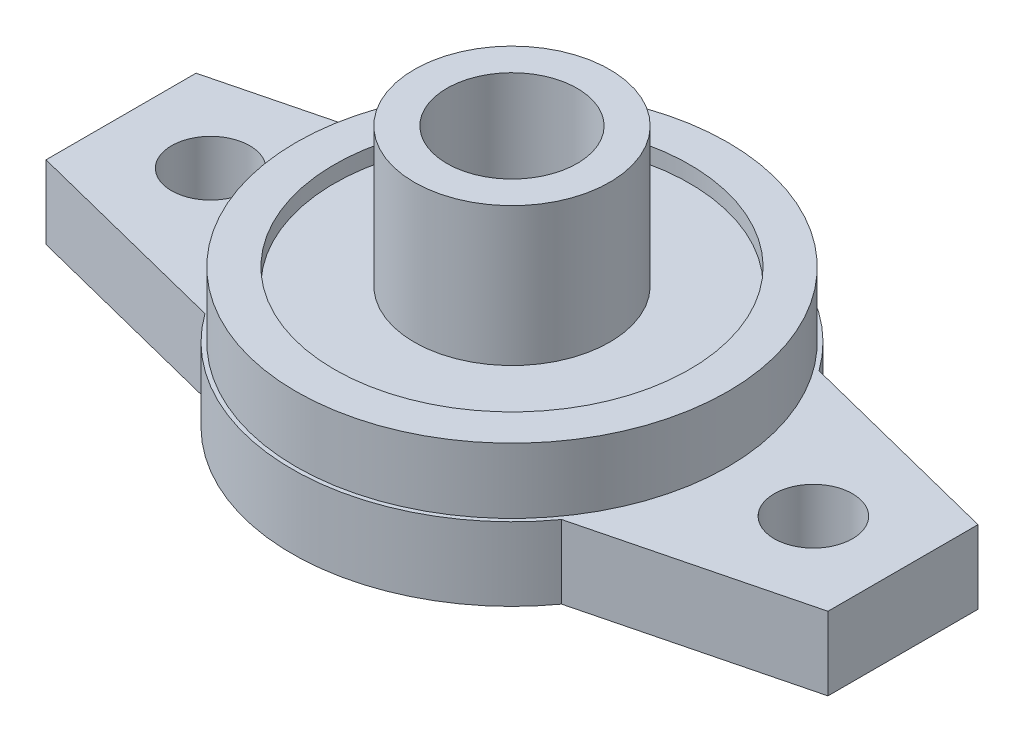
ISO-10303-21;
HEADER;
FILE_DESCRIPTION(('STEP AP214'),'2;1');
FILE_NAME('part.step','',(''),(''),'','','');
FILE_SCHEMA(('AUTOMOTIVE_DESIGN { 1 0 10303 214 1 1 1 1 }'));
ENDSEC;
DATA;
#1=APPLICATION_CONTEXT('core data for automotive mechanical design processes');
#2=APPLICATION_PROTOCOL_DEFINITION('international standard','automotive_design',2000,#1);
#3=PRODUCT_CONTEXT('',#1,'mechanical');
#4=PRODUCT('Part','Part','',(#3));
#5=PRODUCT_RELATED_PRODUCT_CATEGORY('part','',(#4));
#6=PRODUCT_DEFINITION_FORMATION('','',#4);
#7=PRODUCT_DEFINITION_CONTEXT('part definition',#1,'design');
#8=PRODUCT_DEFINITION('design','',#6,#7);
#9=PRODUCT_DEFINITION_SHAPE('','',#8);
#10=(LENGTH_UNIT() NAMED_UNIT(*) SI_UNIT(.MILLI.,.METRE.));
#11=(NAMED_UNIT(*) PLANE_ANGLE_UNIT() SI_UNIT($,.RADIAN.));
#12=(NAMED_UNIT(*) SI_UNIT($,.STERADIAN.) SOLID_ANGLE_UNIT());
#13=UNCERTAINTY_MEASURE_WITH_UNIT(LENGTH_MEASURE(1.E-05),#10,'distance_accuracy_value','');
#14=(GEOMETRIC_REPRESENTATION_CONTEXT(3) GLOBAL_UNCERTAINTY_ASSIGNED_CONTEXT((#13)) GLOBAL_UNIT_ASSIGNED_CONTEXT((#10,
#11,#12)) REPRESENTATION_CONTEXT('',''));
#15=CARTESIAN_POINT('',(0.,0.,0.));
#16=DIRECTION('',(0.,0.,1.));
#17=DIRECTION('',(1.,0.,0.));
#18=AXIS2_PLACEMENT_3D('',#15,#16,#17);
#19=CARTESIAN_POINT('',(0.,8.5,0.));
#20=DIRECTION('',(0.,1.,0.));
#21=DIRECTION('',(0.,0.,1.));
#22=AXIS2_PLACEMENT_3D('',#19,#20,#21);
#23=PLANE('',#22);
#24=CARTESIAN_POINT('',(0.,8.5,0.));
#25=DIRECTION('',(0.,1.,0.));
#26=DIRECTION('',(0.,0.,1.));
#27=AXIS2_PLACEMENT_3D('',#24,#25,#26);
#28=CIRCLE('',#27,10.9);
#29=CARTESIAN_POINT('',(0.,8.5,10.9));
#30=VERTEX_POINT('',#29);
#31=EDGE_CURVE('E209',#30,#30,#28,.T.);
#32=ORIENTED_EDGE('',*,*,#31,.F.);
#33=EDGE_LOOP('',(#32));
#34=FACE_BOUND('',#33,.T.);
#35=CARTESIAN_POINT('',(0.,8.5,0.));
#36=DIRECTION('',(0.,1.,0.));
#37=DIRECTION('',(0.,0.,1.));
#38=AXIS2_PLACEMENT_3D('',#35,#36,#37);
#39=CIRCLE('',#38,13.25);
#40=CARTESIAN_POINT('',(0.,8.5,13.25));
#41=VERTEX_POINT('',#40);
#42=EDGE_CURVE('E143',#41,#41,#39,.T.);
#43=ORIENTED_EDGE('',*,*,#42,.T.);
#44=EDGE_LOOP('',(#43));
#45=FACE_BOUND('',#44,.T.);
#46=ADVANCED_FACE('F37',(#34,#45),#23,.T.);
#47=CARTESIAN_POINT('',(0.,4.5,0.));
#48=DIRECTION('',(0.,1.,0.));
#49=DIRECTION('',(0.,0.,1.));
#50=AXIS2_PLACEMENT_3D('',#47,#48,#49);
#51=PLANE('',#50);
#52=CARTESIAN_POINT('',(18.5,4.5,0.));
#53=DIRECTION('',(0.,1.,0.));
#54=DIRECTION('',(0.,0.,1.));
#55=AXIS2_PLACEMENT_3D('',#52,#53,#54);
#56=CIRCLE('',#55,2.4);
#57=CARTESIAN_POINT('',(18.5,4.5,2.4));
#58=VERTEX_POINT('',#57);
#59=EDGE_CURVE('E131',#58,#58,#56,.F.);
#60=ORIENTED_EDGE('',*,*,#59,.T.);
#61=EDGE_LOOP('',(#60));
#62=FACE_BOUND('',#61,.T.);
#63=DIRECTION('',(0.96954322901117,0.,0.244920246363167));
#64=VECTOR('',#63,1.);
#65=CARTESIAN_POINT('',(-2.5331585410498,4.5,10.0277814837932));
#66=LINE('',#65,#64);
#67=CARTESIAN_POINT('',(-24.,4.5,4.60495561956913));
#68=VERTEX_POINT('',#67);
#69=CARTESIAN_POINT('',(-10.945124025003,4.5,7.90280077423838));
#70=VERTEX_POINT('',#69);
#71=EDGE_CURVE('E192',#68,#70,#66,.T.);
#72=ORIENTED_EDGE('',*,*,#71,.T.);
#73=CARTESIAN_POINT('',(0.,4.5,0.));
#74=DIRECTION('',(0.,1.,0.));
#75=DIRECTION('',(0.,0.,1.));
#76=AXIS2_PLACEMENT_3D('',#73,#74,#75);
#77=CIRCLE('',#76,13.5);
#78=CARTESIAN_POINT('',(10.945124025003,4.5,7.90280077423838));
#79=VERTEX_POINT('',#78);
#80=EDGE_CURVE('E93',#70,#79,#77,.T.);
#81=ORIENTED_EDGE('',*,*,#80,.T.);
#82=DIRECTION('',(-0.96954322901117,0.,0.244920246363167));
#83=VECTOR('',#82,1.);
#84=CARTESIAN_POINT('',(2.5331585410498,4.5,10.0277814837932));
#85=LINE('',#84,#83);
#86=CARTESIAN_POINT('',(24.,4.5,4.60495561956913));
#87=VERTEX_POINT('',#86);
#88=EDGE_CURVE('E178',#87,#79,#85,.T.);
#89=ORIENTED_EDGE('',*,*,#88,.F.);
#90=DIRECTION('',(0.,0.,1.));
#91=VECTOR('',#90,1.);
#92=CARTESIAN_POINT('',(24.,4.5,0.));
#93=LINE('',#92,#91);
#94=CARTESIAN_POINT('',(24.,4.5,-4.60495561956913));
#95=VERTEX_POINT('',#94);
#96=EDGE_CURVE('E190',#95,#87,#93,.T.);
#97=ORIENTED_EDGE('',*,*,#96,.F.);
#98=DIRECTION('',(-0.96954322901117,0.,-0.244920246363167));
#99=VECTOR('',#98,1.);
#100=CARTESIAN_POINT('',(2.5331585410498,4.5,-10.0277814837932));
#101=LINE('',#100,#99);
#102=CARTESIAN_POINT('',(10.945124025003,4.5,-7.90280077423838));
#103=VERTEX_POINT('',#102);
#104=EDGE_CURVE('E114',#95,#103,#101,.T.);
#105=ORIENTED_EDGE('',*,*,#104,.T.);
#106=CARTESIAN_POINT('',(-10.945124025003,4.5,-7.90280077423838));
#107=VERTEX_POINT('',#106);
#108=EDGE_CURVE('E106',#103,#107,#77,.T.);
#109=ORIENTED_EDGE('',*,*,#108,.T.);
#110=DIRECTION('',(0.96954322901117,0.,-0.244920246363167));
#111=VECTOR('',#110,1.);
#112=CARTESIAN_POINT('',(-2.5331585410498,4.5,-10.0277814837932));
#113=LINE('',#112,#111);
#114=CARTESIAN_POINT('',(-24.,4.5,-4.60495561956913));
#115=VERTEX_POINT('',#114);
#116=EDGE_CURVE('E111',#115,#107,#113,.T.);
#117=ORIENTED_EDGE('',*,*,#116,.F.);
#118=DIRECTION('',(0.,0.,1.));
#119=VECTOR('',#118,1.);
#120=CARTESIAN_POINT('',(-24.,4.5,0.));
#121=LINE('',#120,#119);
#122=EDGE_CURVE('E54',#115,#68,#121,.T.);
#123=ORIENTED_EDGE('',*,*,#122,.T.);
#124=EDGE_LOOP('',(#72,#81,#89,#97,#105,#109,#117,#123));
#125=FACE_BOUND('',#124,.T.);
#126=CARTESIAN_POINT('',(-18.5,4.5,0.));
#127=DIRECTION('',(0.,1.,0.));
#128=DIRECTION('',(0.,0.,1.));
#129=AXIS2_PLACEMENT_3D('',#126,#127,#128);
#130=CIRCLE('',#129,2.4);
#131=CARTESIAN_POINT('',(-18.5,4.5,2.4));
#132=VERTEX_POINT('',#131);
#133=EDGE_CURVE('E166',#132,#132,#130,.T.);
#134=ORIENTED_EDGE('',*,*,#133,.F.);
#135=EDGE_LOOP('',(#134));
#136=FACE_BOUND('',#135,.T.);
#137=CARTESIAN_POINT('',(0.,4.5,0.));
#138=DIRECTION('',(0.,1.,0.));
#139=DIRECTION('',(0.,0.,1.));
#140=AXIS2_PLACEMENT_3D('',#137,#138,#139);
#141=CIRCLE('',#140,13.25);
#142=CARTESIAN_POINT('',(0.,4.5,13.25));
#143=VERTEX_POINT('',#142);
#144=EDGE_CURVE('E197',#143,#143,#141,.T.);
#145=ORIENTED_EDGE('',*,*,#144,.F.);
#146=EDGE_LOOP('',(#145));
#147=FACE_BOUND('',#146,.T.);
#148=ADVANCED_FACE('F108',(#62,#125,#136,#147),#51,.T.);
#149=CARTESIAN_POINT('',(-2.5331585410498,4.5,10.0277814837932));
#150=DIRECTION('',(0.244920246363167,0.,-0.96954322901117));
#151=DIRECTION('',(-0.96954322901117,0.,-0.244920246363167));
#152=AXIS2_PLACEMENT_3D('',#149,#150,#151);
#153=PLANE('',#152);
#154=DIRECTION('',(0.96954322901117,0.,0.244920246363167));
#155=VECTOR('',#154,1.);
#156=CARTESIAN_POINT('',(-2.5331585410498,0.,10.0277814837932));
#157=LINE('',#156,#155);
#158=CARTESIAN_POINT('',(-24.,0.,4.60495561956913));
#159=VERTEX_POINT('',#158);
#160=CARTESIAN_POINT('',(-10.945124025003,0.,7.90280077423838));
#161=VERTEX_POINT('',#160);
#162=EDGE_CURVE('E142',#159,#161,#157,.T.);
#163=ORIENTED_EDGE('',*,*,#162,.T.);
#164=DIRECTION('',(0.,-1.,0.));
#165=VECTOR('',#164,1.);
#166=CARTESIAN_POINT('',(-10.945124025003,4.5,7.90280077423838));
#167=LINE('',#166,#165);
#168=EDGE_CURVE('E11',#70,#161,#167,.T.);
#169=ORIENTED_EDGE('',*,*,#168,.F.);
#170=ORIENTED_EDGE('',*,*,#71,.F.);
#171=DIRECTION('',(0.,-1.,0.));
#172=VECTOR('',#171,1.);
#173=CARTESIAN_POINT('',(-24.,4.5,4.60495561956913));
#174=LINE('',#173,#172);
#175=EDGE_CURVE('E138',#68,#159,#174,.T.);
#176=ORIENTED_EDGE('',*,*,#175,.T.);
#177=EDGE_LOOP('',(#163,#169,#170,#176));
#178=FACE_BOUND('',#177,.T.);
#179=ADVANCED_FACE('F245',(#178),#153,.F.);
#180=CARTESIAN_POINT('',(0.,4.5,0.));
#181=DIRECTION('',(0.,-1.,0.));
#182=DIRECTION('',(0.,0.,-1.));
#183=AXIS2_PLACEMENT_3D('',#180,#181,#182);
#184=CYLINDRICAL_SURFACE('',#183,13.5);
#185=CARTESIAN_POINT('',(0.,0.,0.));
#186=DIRECTION('',(0.,1.,0.));
#187=DIRECTION('',(0.,0.,1.));
#188=AXIS2_PLACEMENT_3D('',#185,#186,#187);
#189=CIRCLE('',#188,13.5);
#190=CARTESIAN_POINT('',(10.945124025003,0.,7.90280077423838));
#191=VERTEX_POINT('',#190);
#192=EDGE_CURVE('E146',#161,#191,#189,.T.);
#193=ORIENTED_EDGE('',*,*,#192,.T.);
#194=DIRECTION('',(0.,-1.,0.));
#195=VECTOR('',#194,1.);
#196=CARTESIAN_POINT('',(10.945124025003,4.5,7.90280077423838));
#197=LINE('',#196,#195);
#198=EDGE_CURVE('E46',#79,#191,#197,.T.);
#199=ORIENTED_EDGE('',*,*,#198,.F.);
#200=ORIENTED_EDGE('',*,*,#80,.F.);
#201=ORIENTED_EDGE('',*,*,#168,.T.);
#202=EDGE_LOOP('',(#193,#199,#200,#201));
#203=FACE_BOUND('',#202,.T.);
#204=ADVANCED_FACE('F179',(#203),#184,.T.);
#205=CARTESIAN_POINT('',(2.5331585410498,4.5,10.0277814837932));
#206=DIRECTION('',(0.244920246363167,0.,0.96954322901117));
#207=DIRECTION('',(0.96954322901117,0.,-0.244920246363167));
#208=AXIS2_PLACEMENT_3D('',#205,#206,#207);
#209=PLANE('',#208);
#210=DIRECTION('',(-0.96954322901117,0.,0.244920246363167));
#211=VECTOR('',#210,1.);
#212=CARTESIAN_POINT('',(2.5331585410498,0.,10.0277814837932));
#213=LINE('',#212,#211);
#214=CARTESIAN_POINT('',(24.,0.,4.60495561956913));
#215=VERTEX_POINT('',#214);
#216=EDGE_CURVE('E149',#215,#191,#213,.T.);
#217=ORIENTED_EDGE('',*,*,#216,.F.);
#218=DIRECTION('',(0.,-1.,0.));
#219=VECTOR('',#218,1.);
#220=CARTESIAN_POINT('',(24.,4.5,4.60495561956913));
#221=LINE('',#220,#219);
#222=EDGE_CURVE('E172',#87,#215,#221,.T.);
#223=ORIENTED_EDGE('',*,*,#222,.F.);
#224=ORIENTED_EDGE('',*,*,#88,.T.);
#225=ORIENTED_EDGE('',*,*,#198,.T.);
#226=EDGE_LOOP('',(#217,#223,#224,#225));
#227=FACE_BOUND('',#226,.T.);
#228=ADVANCED_FACE('F176',(#227),#209,.T.);
#229=CARTESIAN_POINT('',(24.,4.5,0.));
#230=DIRECTION('',(1.,0.,0.));
#231=DIRECTION('',(0.,0.,-1.));
#232=AXIS2_PLACEMENT_3D('',#229,#230,#231);
#233=PLANE('',#232);
#234=DIRECTION('',(0.,0.,1.));
#235=VECTOR('',#234,1.);
#236=CARTESIAN_POINT('',(24.,0.,0.));
#237=LINE('',#236,#235);
#238=CARTESIAN_POINT('',(24.,0.,-4.60495561956913));
#239=VERTEX_POINT('',#238);
#240=EDGE_CURVE('E152',#239,#215,#237,.T.);
#241=ORIENTED_EDGE('',*,*,#240,.F.);
#242=DIRECTION('',(0.,-1.,0.));
#243=VECTOR('',#242,1.);
#244=CARTESIAN_POINT('',(24.,4.5,-4.60495561956913));
#245=LINE('',#244,#243);
#246=EDGE_CURVE('E170',#95,#239,#245,.T.);
#247=ORIENTED_EDGE('',*,*,#246,.F.);
#248=ORIENTED_EDGE('',*,*,#96,.T.);
#249=ORIENTED_EDGE('',*,*,#222,.T.);
#250=EDGE_LOOP('',(#241,#247,#248,#249));
#251=FACE_BOUND('',#250,.T.);
#252=ADVANCED_FACE('F188',(#251),#233,.T.);
#253=CARTESIAN_POINT('',(2.5331585410498,4.5,-10.0277814837932));
#254=DIRECTION('',(-0.244920246363167,0.,0.96954322901117));
#255=DIRECTION('',(0.96954322901117,0.,0.244920246363167));
#256=AXIS2_PLACEMENT_3D('',#253,#254,#255);
#257=PLANE('',#256);
#258=DIRECTION('',(-0.96954322901117,0.,-0.244920246363167));
#259=VECTOR('',#258,1.);
#260=CARTESIAN_POINT('',(2.5331585410498,0.,-10.0277814837932));
#261=LINE('',#260,#259);
#262=CARTESIAN_POINT('',(10.945124025003,0.,-7.90280077423838));
#263=VERTEX_POINT('',#262);
#264=EDGE_CURVE('E155',#239,#263,#261,.T.);
#265=ORIENTED_EDGE('',*,*,#264,.T.);
#266=DIRECTION('',(0.,-1.,0.));
#267=VECTOR('',#266,1.);
#268=CARTESIAN_POINT('',(10.945124025003,4.5,-7.90280077423838));
#269=LINE('',#268,#267);
#270=EDGE_CURVE('E127',#103,#263,#269,.T.);
#271=ORIENTED_EDGE('',*,*,#270,.F.);
#272=ORIENTED_EDGE('',*,*,#104,.F.);
#273=ORIENTED_EDGE('',*,*,#246,.T.);
#274=EDGE_LOOP('',(#265,#271,#272,#273));
#275=FACE_BOUND('',#274,.T.);
#276=ADVANCED_FACE('F271',(#275),#257,.F.);
#277=CARTESIAN_POINT('',(-10.945124025003,0.,-7.90280077423838));
#278=VERTEX_POINT('',#277);
#279=EDGE_CURVE('E123',#263,#278,#189,.T.);
#280=ORIENTED_EDGE('',*,*,#279,.T.);
#281=DIRECTION('',(0.,-1.,0.));
#282=VECTOR('',#281,1.);
#283=CARTESIAN_POINT('',(-10.945124025003,4.5,-7.90280077423838));
#284=LINE('',#283,#282);
#285=EDGE_CURVE('E120',#107,#278,#284,.T.);
#286=ORIENTED_EDGE('',*,*,#285,.F.);
#287=ORIENTED_EDGE('',*,*,#108,.F.);
#288=ORIENTED_EDGE('',*,*,#270,.T.);
#289=EDGE_LOOP('',(#280,#286,#287,#288));
#290=FACE_BOUND('',#289,.T.);
#291=ADVANCED_FACE('F121',(#290),#184,.T.);
#292=CARTESIAN_POINT('',(-2.5331585410498,4.5,-10.0277814837932));
#293=DIRECTION('',(-0.244920246363167,0.,-0.96954322901117));
#294=DIRECTION('',(-0.96954322901117,0.,0.244920246363167));
#295=AXIS2_PLACEMENT_3D('',#292,#293,#294);
#296=PLANE('',#295);
#297=DIRECTION('',(0.96954322901117,0.,-0.244920246363167));
#298=VECTOR('',#297,1.);
#299=CARTESIAN_POINT('',(-2.5331585410498,0.,-10.0277814837932));
#300=LINE('',#299,#298);
#301=CARTESIAN_POINT('',(-24.,0.,-4.60495561956913));
#302=VERTEX_POINT('',#301);
#303=EDGE_CURVE('E157',#302,#278,#300,.T.);
#304=ORIENTED_EDGE('',*,*,#303,.F.);
#305=DIRECTION('',(0.,-1.,0.));
#306=VECTOR('',#305,1.);
#307=CARTESIAN_POINT('',(-24.,4.5,-4.60495561956913));
#308=LINE('',#307,#306);
#309=EDGE_CURVE('E82',#115,#302,#308,.T.);
#310=ORIENTED_EDGE('',*,*,#309,.F.);
#311=ORIENTED_EDGE('',*,*,#116,.T.);
#312=ORIENTED_EDGE('',*,*,#285,.T.);
#313=EDGE_LOOP('',(#304,#310,#311,#312));
#314=FACE_BOUND('',#313,.T.);
#315=ADVANCED_FACE('F129',(#314),#296,.T.);
#316=CARTESIAN_POINT('',(0.,4.5,0.));
#317=DIRECTION('',(0.,-1.,0.));
#318=DIRECTION('',(0.,0.,-1.));
#319=AXIS2_PLACEMENT_3D('',#316,#317,#318);
#320=CYLINDRICAL_SURFACE('',#319,4.);
#321=CARTESIAN_POINT('',(0.,0.,0.));
#322=DIRECTION('',(0.,1.,0.));
#323=DIRECTION('',(0.,0.,1.));
#324=AXIS2_PLACEMENT_3D('',#321,#322,#323);
#325=CIRCLE('',#324,4.);
#326=CARTESIAN_POINT('',(0.,0.,4.));
#327=VERTEX_POINT('',#326);
#328=EDGE_CURVE('E160',#327,#327,#325,.T.);
#329=ORIENTED_EDGE('',*,*,#328,.F.);
#330=EDGE_LOOP('',(#329));
#331=FACE_BOUND('',#330,.T.);
#332=CARTESIAN_POINT('',(0.,16.,0.));
#333=DIRECTION('',(0.,1.,0.));
#334=DIRECTION('',(0.,0.,1.));
#335=AXIS2_PLACEMENT_3D('',#332,#333,#334);
#336=CIRCLE('',#335,4.);
#337=CARTESIAN_POINT('',(0.,16.,4.));
#338=VERTEX_POINT('',#337);
#339=EDGE_CURVE('E205',#338,#338,#336,.T.);
#340=ORIENTED_EDGE('',*,*,#339,.T.);
#341=EDGE_LOOP('',(#340));
#342=FACE_BOUND('',#341,.T.);
#343=ADVANCED_FACE('F260',(#331,#342),#320,.F.);
#344=CARTESIAN_POINT('',(-24.,4.5,0.));
#345=DIRECTION('',(1.,0.,0.));
#346=DIRECTION('',(0.,0.,-1.));
#347=AXIS2_PLACEMENT_3D('',#344,#345,#346);
#348=PLANE('',#347);
#349=DIRECTION('',(0.,0.,1.));
#350=VECTOR('',#349,1.);
#351=CARTESIAN_POINT('',(-24.,0.,0.));
#352=LINE('',#351,#350);
#353=EDGE_CURVE('E85',#302,#159,#352,.T.);
#354=ORIENTED_EDGE('',*,*,#353,.T.);
#355=ORIENTED_EDGE('',*,*,#175,.F.);
#356=ORIENTED_EDGE('',*,*,#122,.F.);
#357=ORIENTED_EDGE('',*,*,#309,.T.);
#358=EDGE_LOOP('',(#354,#355,#356,#357));
#359=FACE_BOUND('',#358,.T.);
#360=ADVANCED_FACE('F263',(#359),#348,.F.);
#361=CARTESIAN_POINT('',(-18.5,4.5,0.));
#362=DIRECTION('',(0.,-1.,0.));
#363=DIRECTION('',(0.,0.,-1.));
#364=AXIS2_PLACEMENT_3D('',#361,#362,#363);
#365=CYLINDRICAL_SURFACE('',#364,2.4);
#366=ORIENTED_EDGE('',*,*,#133,.T.);
#367=EDGE_LOOP('',(#366));
#368=FACE_BOUND('',#367,.T.);
#369=CARTESIAN_POINT('',(-18.5,0.,0.));
#370=DIRECTION('',(0.,1.,0.));
#371=DIRECTION('',(0.,0.,1.));
#372=AXIS2_PLACEMENT_3D('',#369,#370,#371);
#373=CIRCLE('',#372,2.4);
#374=CARTESIAN_POINT('',(-18.5,0.,2.4));
#375=VERTEX_POINT('',#374);
#376=EDGE_CURVE('E139',#375,#375,#373,.T.);
#377=ORIENTED_EDGE('',*,*,#376,.F.);
#378=EDGE_LOOP('',(#377));
#379=FACE_BOUND('',#378,.T.);
#380=ADVANCED_FACE('F39',(#368,#379),#365,.F.);
#381=CARTESIAN_POINT('',(18.5,4.5,0.));
#382=DIRECTION('',(0.,-1.,0.));
#383=DIRECTION('',(0.,0.,-1.));
#384=AXIS2_PLACEMENT_3D('',#381,#382,#383);
#385=CYLINDRICAL_SURFACE('',#384,2.4);
#386=ORIENTED_EDGE('',*,*,#59,.F.);
#387=EDGE_LOOP('',(#386));
#388=FACE_BOUND('',#387,.T.);
#389=CARTESIAN_POINT('',(18.5,0.,0.));
#390=DIRECTION('',(0.,1.,0.));
#391=DIRECTION('',(0.,0.,1.));
#392=AXIS2_PLACEMENT_3D('',#389,#390,#391);
#393=CIRCLE('',#392,2.4);
#394=CARTESIAN_POINT('',(18.5,0.,2.4));
#395=VERTEX_POINT('',#394);
#396=EDGE_CURVE('E163',#395,#395,#393,.F.);
#397=ORIENTED_EDGE('',*,*,#396,.T.);
#398=EDGE_LOOP('',(#397));
#399=FACE_BOUND('',#398,.T.);
#400=ADVANCED_FACE('F255',(#388,#399),#385,.F.);
#401=CARTESIAN_POINT('',(0.,0.,0.));
#402=DIRECTION('',(0.,1.,0.));
#403=DIRECTION('',(0.,0.,1.));
#404=AXIS2_PLACEMENT_3D('',#401,#402,#403);
#405=PLANE('',#404);
#406=ORIENTED_EDGE('',*,*,#376,.T.);
#407=EDGE_LOOP('',(#406));
#408=FACE_BOUND('',#407,.T.);
#409=ORIENTED_EDGE('',*,*,#162,.F.);
#410=ORIENTED_EDGE('',*,*,#353,.F.);
#411=ORIENTED_EDGE('',*,*,#303,.T.);
#412=ORIENTED_EDGE('',*,*,#279,.F.);
#413=ORIENTED_EDGE('',*,*,#264,.F.);
#414=ORIENTED_EDGE('',*,*,#240,.T.);
#415=ORIENTED_EDGE('',*,*,#216,.T.);
#416=ORIENTED_EDGE('',*,*,#192,.F.);
#417=EDGE_LOOP('',(#409,#410,#411,#412,#413,#414,#415,#416));
#418=FACE_BOUND('',#417,.T.);
#419=ORIENTED_EDGE('',*,*,#328,.T.);
#420=EDGE_LOOP('',(#419));
#421=FACE_BOUND('',#420,.T.);
#422=ORIENTED_EDGE('',*,*,#396,.F.);
#423=EDGE_LOOP('',(#422));
#424=FACE_BOUND('',#423,.T.);
#425=ADVANCED_FACE('F183',(#408,#418,#421,#424),#405,.F.);
#426=CARTESIAN_POINT('',(0.,8.5,0.));
#427=DIRECTION('',(0.,-1.,0.));
#428=DIRECTION('',(0.,0.,-1.));
#429=AXIS2_PLACEMENT_3D('',#426,#427,#428);
#430=CYLINDRICAL_SURFACE('',#429,13.25);
#431=ORIENTED_EDGE('',*,*,#42,.F.);
#432=EDGE_LOOP('',(#431));
#433=FACE_BOUND('',#432,.T.);
#434=ORIENTED_EDGE('',*,*,#144,.T.);
#435=EDGE_LOOP('',(#434));
#436=FACE_BOUND('',#435,.T.);
#437=ADVANCED_FACE('F237',(#433,#436),#430,.T.);
#438=CARTESIAN_POINT('',(0.,16.,0.));
#439=DIRECTION('',(0.,1.,0.));
#440=DIRECTION('',(0.,0.,1.));
#441=AXIS2_PLACEMENT_3D('',#438,#439,#440);
#442=PLANE('',#441);
#443=CARTESIAN_POINT('',(0.,16.,0.));
#444=DIRECTION('',(0.,1.,0.));
#445=DIRECTION('',(0.,0.,1.));
#446=AXIS2_PLACEMENT_3D('',#443,#444,#445);
#447=CIRCLE('',#446,6.);
#448=CARTESIAN_POINT('',(0.,16.,6.));
#449=VERTEX_POINT('',#448);
#450=EDGE_CURVE('E200',#449,#449,#447,.T.);
#451=ORIENTED_EDGE('',*,*,#450,.T.);
#452=EDGE_LOOP('',(#451));
#453=FACE_BOUND('',#452,.T.);
#454=ORIENTED_EDGE('',*,*,#339,.F.);
#455=EDGE_LOOP('',(#454));
#456=FACE_BOUND('',#455,.T.);
#457=ADVANCED_FACE('F240',(#453,#456),#442,.T.);
#458=CARTESIAN_POINT('',(0.,16.,0.));
#459=DIRECTION('',(0.,-1.,0.));
#460=DIRECTION('',(0.,0.,-1.));
#461=AXIS2_PLACEMENT_3D('',#458,#459,#460);
#462=CYLINDRICAL_SURFACE('',#461,6.);
#463=ORIENTED_EDGE('',*,*,#450,.F.);
#464=EDGE_LOOP('',(#463));
#465=FACE_BOUND('',#464,.T.);
#466=CARTESIAN_POINT('',(0.,7.5,0.));
#467=DIRECTION('',(0.,1.,0.));
#468=DIRECTION('',(0.,0.,1.));
#469=AXIS2_PLACEMENT_3D('',#466,#467,#468);
#470=CIRCLE('',#469,6.);
#471=CARTESIAN_POINT('',(0.,7.5,6.));
#472=VERTEX_POINT('',#471);
#473=EDGE_CURVE('E212',#472,#472,#470,.T.);
#474=ORIENTED_EDGE('',*,*,#473,.T.);
#475=EDGE_LOOP('',(#474));
#476=FACE_BOUND('',#475,.T.);
#477=ADVANCED_FACE('F218',(#465,#476),#462,.T.);
#478=CARTESIAN_POINT('',(0.,7.5,0.));
#479=DIRECTION('',(0.,1.,0.));
#480=DIRECTION('',(0.,0.,1.));
#481=AXIS2_PLACEMENT_3D('',#478,#479,#480);
#482=CYLINDRICAL_SURFACE('',#481,10.9);
#483=CARTESIAN_POINT('',(0.,7.5,0.));
#484=DIRECTION('',(0.,1.,0.));
#485=DIRECTION('',(0.,0.,1.));
#486=AXIS2_PLACEMENT_3D('',#483,#484,#485);
#487=CIRCLE('',#486,10.9);
#488=CARTESIAN_POINT('',(0.,7.5,10.9));
#489=VERTEX_POINT('',#488);
#490=EDGE_CURVE('E208',#489,#489,#487,.T.);
#491=ORIENTED_EDGE('',*,*,#490,.F.);
#492=EDGE_LOOP('',(#491));
#493=FACE_BOUND('',#492,.T.);
#494=ORIENTED_EDGE('',*,*,#31,.T.);
#495=EDGE_LOOP('',(#494));
#496=FACE_BOUND('',#495,.T.);
#497=ADVANCED_FACE('F223',(#493,#496),#482,.F.);
#498=CARTESIAN_POINT('',(0.,7.5,0.));
#499=DIRECTION('',(0.,1.,0.));
#500=DIRECTION('',(0.,0.,1.));
#501=AXIS2_PLACEMENT_3D('',#498,#499,#500);
#502=PLANE('',#501);
#503=ORIENTED_EDGE('',*,*,#473,.F.);
#504=EDGE_LOOP('',(#503));
#505=FACE_BOUND('',#504,.T.);
#506=ORIENTED_EDGE('',*,*,#490,.T.);
#507=EDGE_LOOP('',(#506));
#508=FACE_BOUND('',#507,.T.);
#509=ADVANCED_FACE('F220',(#505,#508),#502,.T.);
#510=CLOSED_SHELL('',(#46,#148,#179,#204,#228,#252,#276,#291,#315,#343,#360,#380,#400,#425,#437,
#457,#477,#497,#509));
#511=MANIFOLD_SOLID_BREP('B2',#510);
#512=ADVANCED_BREP_SHAPE_REPRESENTATION('',(#18,#511),#14);
#513=SHAPE_DEFINITION_REPRESENTATION(#9,#512);
ENDSEC;
END-ISO-10303-21;
